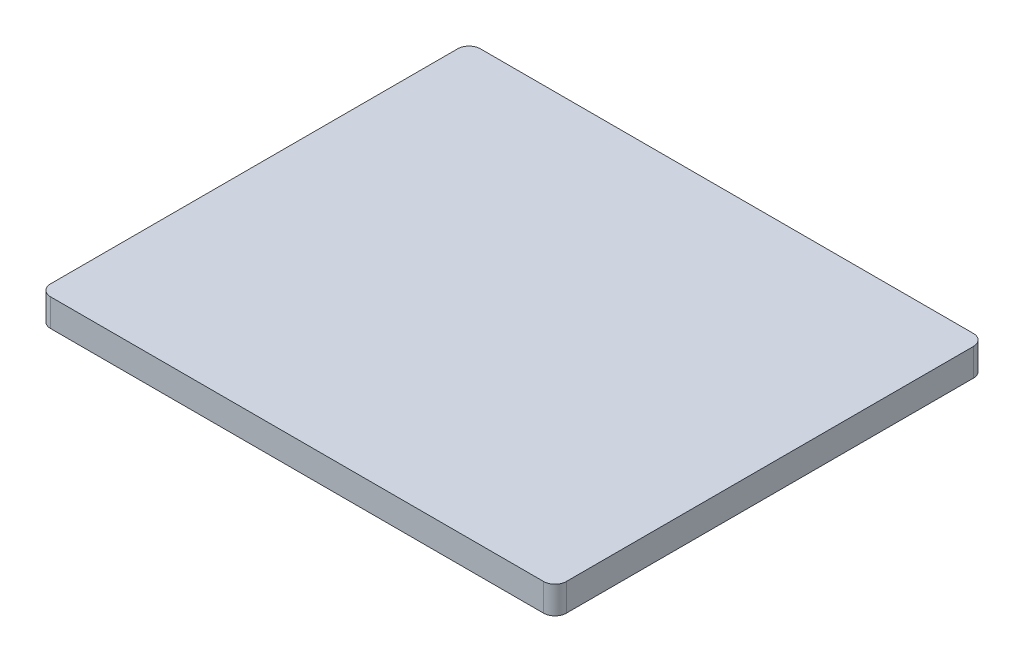
ISO-10303-21;
HEADER;
FILE_DESCRIPTION(('STEP AP214'),'2;1');
FILE_NAME('part.step','',(''),(''),'','','');
FILE_SCHEMA(('AUTOMOTIVE_DESIGN { 1 0 10303 214 1 1 1 1 }'));
ENDSEC;
DATA;
#1=APPLICATION_CONTEXT('core data for automotive mechanical design processes');
#2=APPLICATION_PROTOCOL_DEFINITION('international standard','automotive_design',2000,#1);
#3=PRODUCT_CONTEXT('',#1,'mechanical');
#4=PRODUCT('Part','Part','',(#3));
#5=PRODUCT_RELATED_PRODUCT_CATEGORY('part','',(#4));
#6=PRODUCT_DEFINITION_FORMATION('','',#4);
#7=PRODUCT_DEFINITION_CONTEXT('part definition',#1,'design');
#8=PRODUCT_DEFINITION('design','',#6,#7);
#9=PRODUCT_DEFINITION_SHAPE('','',#8);
#10=(LENGTH_UNIT() NAMED_UNIT(*) SI_UNIT(.MILLI.,.METRE.));
#11=(NAMED_UNIT(*) PLANE_ANGLE_UNIT() SI_UNIT($,.RADIAN.));
#12=(NAMED_UNIT(*) SI_UNIT($,.STERADIAN.) SOLID_ANGLE_UNIT());
#13=UNCERTAINTY_MEASURE_WITH_UNIT(LENGTH_MEASURE(1.E-05),#10,'distance_accuracy_value','');
#14=(GEOMETRIC_REPRESENTATION_CONTEXT(3) GLOBAL_UNCERTAINTY_ASSIGNED_CONTEXT((#13)) GLOBAL_UNIT_ASSIGNED_CONTEXT((#10,
#11,#12)) REPRESENTATION_CONTEXT('',''));
#15=CARTESIAN_POINT('',(0.,0.,0.));
#16=DIRECTION('',(0.,0.,1.));
#17=DIRECTION('',(1.,0.,0.));
#18=AXIS2_PLACEMENT_3D('',#15,#16,#17);
#19=CARTESIAN_POINT('',(143.396,16.,-118.396));
#20=DIRECTION('',(0.,-1.,0.));
#21=DIRECTION('',(0.,0.,-1.));
#22=AXIS2_PLACEMENT_3D('',#19,#20,#21);
#23=CYLINDRICAL_SURFACE('',#22,6.604);
#24=CARTESIAN_POINT('',(143.396,0.,-118.396));
#25=DIRECTION('',(0.,1.,0.));
#26=DIRECTION('',(0.,0.,-1.));
#27=AXIS2_PLACEMENT_3D('',#24,#25,#26);
#28=CIRCLE('',#27,6.604);
#29=CARTESIAN_POINT('',(150.,0.,-118.396));
#30=VERTEX_POINT('',#29);
#31=CARTESIAN_POINT('',(143.396,0.,-125.));
#32=VERTEX_POINT('',#31);
#33=EDGE_CURVE('E130',#30,#32,#28,.T.);
#34=ORIENTED_EDGE('',*,*,#33,.T.);
#35=DIRECTION('',(0.,-1.,0.));
#36=VECTOR('',#35,1.);
#37=CARTESIAN_POINT('',(143.396,16.,-125.));
#38=LINE('',#37,#36);
#39=CARTESIAN_POINT('',(143.396,16.,-125.));
#40=VERTEX_POINT('',#39);
#41=EDGE_CURVE('E11',#40,#32,#38,.T.);
#42=ORIENTED_EDGE('',*,*,#41,.F.);
#43=CARTESIAN_POINT('',(143.396,16.,-118.396));
#44=DIRECTION('',(0.,1.,0.));
#45=DIRECTION('',(0.,0.,-1.));
#46=AXIS2_PLACEMENT_3D('',#43,#44,#45);
#47=CIRCLE('',#46,6.604);
#48=CARTESIAN_POINT('',(150.,16.,-118.396));
#49=VERTEX_POINT('',#48);
#50=EDGE_CURVE('E144',#49,#40,#47,.T.);
#51=ORIENTED_EDGE('',*,*,#50,.F.);
#52=DIRECTION('',(0.,-1.,0.));
#53=VECTOR('',#52,1.);
#54=CARTESIAN_POINT('',(150.,16.,-118.396));
#55=LINE('',#54,#53);
#56=EDGE_CURVE('E126',#49,#30,#55,.T.);
#57=ORIENTED_EDGE('',*,*,#56,.T.);
#58=EDGE_LOOP('',(#34,#42,#51,#57));
#59=FACE_BOUND('',#58,.T.);
#60=ADVANCED_FACE('F34',(#59),#23,.T.);
#61=CARTESIAN_POINT('',(-143.396,16.,-125.));
#62=DIRECTION('',(0.,0.,1.));
#63=DIRECTION('',(1.,0.,0.));
#64=AXIS2_PLACEMENT_3D('',#61,#62,#63);
#65=PLANE('',#64);
#66=DIRECTION('',(-1.,0.,0.));
#67=VECTOR('',#66,1.);
#68=CARTESIAN_POINT('',(-143.396,0.,-125.));
#69=LINE('',#68,#67);
#70=CARTESIAN_POINT('',(-143.396,0.,-125.));
#71=VERTEX_POINT('',#70);
#72=EDGE_CURVE('E133',#32,#71,#69,.T.);
#73=ORIENTED_EDGE('',*,*,#72,.T.);
#74=DIRECTION('',(0.,-1.,0.));
#75=VECTOR('',#74,1.);
#76=CARTESIAN_POINT('',(-143.396,16.,-125.));
#77=LINE('',#76,#75);
#78=CARTESIAN_POINT('',(-143.396,16.,-125.));
#79=VERTEX_POINT('',#78);
#80=EDGE_CURVE('E42',#79,#71,#77,.T.);
#81=ORIENTED_EDGE('',*,*,#80,.F.);
#82=DIRECTION('',(-1.,0.,0.));
#83=VECTOR('',#82,1.);
#84=CARTESIAN_POINT('',(-143.396,16.,-125.));
#85=LINE('',#84,#83);
#86=EDGE_CURVE('E93',#40,#79,#85,.T.);
#87=ORIENTED_EDGE('',*,*,#86,.F.);
#88=ORIENTED_EDGE('',*,*,#41,.T.);
#89=EDGE_LOOP('',(#73,#81,#87,#88));
#90=FACE_BOUND('',#89,.T.);
#91=ADVANCED_FACE('F179',(#90),#65,.F.);
#92=CARTESIAN_POINT('',(-143.396,16.,-118.396));
#93=DIRECTION('',(0.,-1.,0.));
#94=DIRECTION('',(0.,0.,-1.));
#95=AXIS2_PLACEMENT_3D('',#92,#93,#94);
#96=CYLINDRICAL_SURFACE('',#95,6.604);
#97=CARTESIAN_POINT('',(-143.396,0.,-118.396));
#98=DIRECTION('',(0.,1.,0.));
#99=DIRECTION('',(0.,0.,1.));
#100=AXIS2_PLACEMENT_3D('',#97,#98,#99);
#101=CIRCLE('',#100,6.604);
#102=CARTESIAN_POINT('',(-150.,0.,-118.396));
#103=VERTEX_POINT('',#102);
#104=EDGE_CURVE('E135',#71,#103,#101,.T.);
#105=ORIENTED_EDGE('',*,*,#104,.T.);
#106=DIRECTION('',(0.,-1.,0.));
#107=VECTOR('',#106,1.);
#108=CARTESIAN_POINT('',(-150.,16.,-118.396));
#109=LINE('',#108,#107);
#110=CARTESIAN_POINT('',(-150.,16.,-118.396));
#111=VERTEX_POINT('',#110);
#112=EDGE_CURVE('E151',#111,#103,#109,.T.);
#113=ORIENTED_EDGE('',*,*,#112,.F.);
#114=CARTESIAN_POINT('',(-143.396,16.,-118.396));
#115=DIRECTION('',(0.,1.,0.));
#116=DIRECTION('',(0.,0.,1.));
#117=AXIS2_PLACEMENT_3D('',#114,#115,#116);
#118=CIRCLE('',#117,6.604);
#119=EDGE_CURVE('E159',#79,#111,#118,.T.);
#120=ORIENTED_EDGE('',*,*,#119,.F.);
#121=ORIENTED_EDGE('',*,*,#80,.T.);
#122=EDGE_LOOP('',(#105,#113,#120,#121));
#123=FACE_BOUND('',#122,.T.);
#124=ADVANCED_FACE('F157',(#123),#96,.T.);
#125=CARTESIAN_POINT('',(-150.,16.,-118.396));
#126=DIRECTION('',(1.,0.,0.));
#127=DIRECTION('',(0.,0.,-1.));
#128=AXIS2_PLACEMENT_3D('',#125,#126,#127);
#129=PLANE('',#128);
#130=DIRECTION('',(0.,0.,1.));
#131=VECTOR('',#130,1.);
#132=CARTESIAN_POINT('',(-150.,0.,-118.396));
#133=LINE('',#132,#131);
#134=CARTESIAN_POINT('',(-150.,0.,118.396));
#135=VERTEX_POINT('',#134);
#136=EDGE_CURVE('E137',#103,#135,#133,.T.);
#137=ORIENTED_EDGE('',*,*,#136,.T.);
#138=DIRECTION('',(0.,-1.,0.));
#139=VECTOR('',#138,1.);
#140=CARTESIAN_POINT('',(-150.,16.,118.396));
#141=LINE('',#140,#139);
#142=CARTESIAN_POINT('',(-150.,16.,118.396));
#143=VERTEX_POINT('',#142);
#144=EDGE_CURVE('E148',#143,#135,#141,.T.);
#145=ORIENTED_EDGE('',*,*,#144,.F.);
#146=DIRECTION('',(0.,0.,1.));
#147=VECTOR('',#146,1.);
#148=CARTESIAN_POINT('',(-150.,16.,-118.396));
#149=LINE('',#148,#147);
#150=EDGE_CURVE('E171',#111,#143,#149,.T.);
#151=ORIENTED_EDGE('',*,*,#150,.F.);
#152=ORIENTED_EDGE('',*,*,#112,.T.);
#153=EDGE_LOOP('',(#137,#145,#151,#152));
#154=FACE_BOUND('',#153,.T.);
#155=ADVANCED_FACE('F167',(#154),#129,.F.);
#156=CARTESIAN_POINT('',(-143.396,16.,118.396));
#157=DIRECTION('',(0.,-1.,0.));
#158=DIRECTION('',(0.,0.,-1.));
#159=AXIS2_PLACEMENT_3D('',#156,#157,#158);
#160=CYLINDRICAL_SURFACE('',#159,6.60400000000001);
#161=CARTESIAN_POINT('',(-143.396,0.,118.396));
#162=DIRECTION('',(0.,1.,0.));
#163=DIRECTION('',(0.,0.,1.));
#164=AXIS2_PLACEMENT_3D('',#161,#162,#163);
#165=CIRCLE('',#164,6.60400000000001);
#166=CARTESIAN_POINT('',(-143.396,0.,125.));
#167=VERTEX_POINT('',#166);
#168=EDGE_CURVE('E139',#135,#167,#165,.T.);
#169=ORIENTED_EDGE('',*,*,#168,.T.);
#170=DIRECTION('',(0.,-1.,0.));
#171=VECTOR('',#170,1.);
#172=CARTESIAN_POINT('',(-143.396,16.,125.));
#173=LINE('',#172,#171);
#174=CARTESIAN_POINT('',(-143.396,16.,125.));
#175=VERTEX_POINT('',#174);
#176=EDGE_CURVE('E121',#175,#167,#173,.T.);
#177=ORIENTED_EDGE('',*,*,#176,.F.);
#178=CARTESIAN_POINT('',(-143.396,16.,118.396));
#179=DIRECTION('',(0.,1.,0.));
#180=DIRECTION('',(0.,0.,1.));
#181=AXIS2_PLACEMENT_3D('',#178,#179,#180);
#182=CIRCLE('',#181,6.60400000000001);
#183=EDGE_CURVE('E112',#143,#175,#182,.T.);
#184=ORIENTED_EDGE('',*,*,#183,.F.);
#185=ORIENTED_EDGE('',*,*,#144,.T.);
#186=EDGE_LOOP('',(#169,#177,#184,#185));
#187=FACE_BOUND('',#186,.T.);
#188=ADVANCED_FACE('F170',(#187),#160,.T.);
#189=CARTESIAN_POINT('',(-143.396,16.,125.));
#190=DIRECTION('',(0.,0.,-1.));
#191=DIRECTION('',(-1.,0.,0.));
#192=AXIS2_PLACEMENT_3D('',#189,#190,#191);
#193=PLANE('',#192);
#194=DIRECTION('',(1.,0.,0.));
#195=VECTOR('',#194,1.);
#196=CARTESIAN_POINT('',(-143.396,0.,125.));
#197=LINE('',#196,#195);
#198=CARTESIAN_POINT('',(143.396,0.,125.));
#199=VERTEX_POINT('',#198);
#200=EDGE_CURVE('E120',#167,#199,#197,.T.);
#201=ORIENTED_EDGE('',*,*,#200,.T.);
#202=DIRECTION('',(0.,-1.,0.));
#203=VECTOR('',#202,1.);
#204=CARTESIAN_POINT('',(143.396,16.,125.));
#205=LINE('',#204,#203);
#206=CARTESIAN_POINT('',(143.396,16.,125.));
#207=VERTEX_POINT('',#206);
#208=EDGE_CURVE('E117',#207,#199,#205,.T.);
#209=ORIENTED_EDGE('',*,*,#208,.F.);
#210=DIRECTION('',(1.,0.,0.));
#211=VECTOR('',#210,1.);
#212=CARTESIAN_POINT('',(-143.396,16.,125.));
#213=LINE('',#212,#211);
#214=EDGE_CURVE('E106',#175,#207,#213,.T.);
#215=ORIENTED_EDGE('',*,*,#214,.F.);
#216=ORIENTED_EDGE('',*,*,#176,.T.);
#217=EDGE_LOOP('',(#201,#209,#215,#216));
#218=FACE_BOUND('',#217,.T.);
#219=ADVANCED_FACE('F118',(#218),#193,.F.);
#220=CARTESIAN_POINT('',(143.396,16.,118.396));
#221=DIRECTION('',(0.,-1.,0.));
#222=DIRECTION('',(0.,0.,-1.));
#223=AXIS2_PLACEMENT_3D('',#220,#221,#222);
#224=CYLINDRICAL_SURFACE('',#223,6.60399999999997);
#225=CARTESIAN_POINT('',(143.396,0.,118.396));
#226=DIRECTION('',(0.,1.,0.));
#227=DIRECTION('',(0.,0.,1.));
#228=AXIS2_PLACEMENT_3D('',#225,#226,#227);
#229=CIRCLE('',#228,6.60399999999997);
#230=CARTESIAN_POINT('',(150.,0.,118.396));
#231=VERTEX_POINT('',#230);
#232=EDGE_CURVE('E79',#199,#231,#229,.T.);
#233=ORIENTED_EDGE('',*,*,#232,.T.);
#234=DIRECTION('',(0.,-1.,0.));
#235=VECTOR('',#234,1.);
#236=CARTESIAN_POINT('',(150.,16.,118.396));
#237=LINE('',#236,#235);
#238=CARTESIAN_POINT('',(150.,16.,118.396));
#239=VERTEX_POINT('',#238);
#240=EDGE_CURVE('E122',#239,#231,#237,.T.);
#241=ORIENTED_EDGE('',*,*,#240,.F.);
#242=CARTESIAN_POINT('',(143.396,16.,118.396));
#243=DIRECTION('',(0.,1.,0.));
#244=DIRECTION('',(0.,0.,1.));
#245=AXIS2_PLACEMENT_3D('',#242,#243,#244);
#246=CIRCLE('',#245,6.60399999999997);
#247=EDGE_CURVE('E110',#207,#239,#246,.T.);
#248=ORIENTED_EDGE('',*,*,#247,.F.);
#249=ORIENTED_EDGE('',*,*,#208,.T.);
#250=EDGE_LOOP('',(#233,#241,#248,#249));
#251=FACE_BOUND('',#250,.T.);
#252=ADVANCED_FACE('F124',(#251),#224,.T.);
#253=CARTESIAN_POINT('',(150.,16.,-118.396));
#254=DIRECTION('',(-1.,0.,0.));
#255=DIRECTION('',(0.,0.,1.));
#256=AXIS2_PLACEMENT_3D('',#253,#254,#255);
#257=PLANE('',#256);
#258=DIRECTION('',(0.,0.,-1.));
#259=VECTOR('',#258,1.);
#260=CARTESIAN_POINT('',(150.,0.,-118.396));
#261=LINE('',#260,#259);
#262=EDGE_CURVE('E85',#231,#30,#261,.T.);
#263=ORIENTED_EDGE('',*,*,#262,.T.);
#264=ORIENTED_EDGE('',*,*,#56,.F.);
#265=DIRECTION('',(0.,0.,-1.));
#266=VECTOR('',#265,1.);
#267=CARTESIAN_POINT('',(150.,16.,-118.396));
#268=LINE('',#267,#266);
#269=EDGE_CURVE('E50',#239,#49,#268,.T.);
#270=ORIENTED_EDGE('',*,*,#269,.F.);
#271=ORIENTED_EDGE('',*,*,#240,.T.);
#272=EDGE_LOOP('',(#263,#264,#270,#271));
#273=FACE_BOUND('',#272,.T.);
#274=ADVANCED_FACE('F195',(#273),#257,.F.);
#275=CARTESIAN_POINT('',(143.396,16.,-118.396));
#276=DIRECTION('',(0.,-1.,0.));
#277=DIRECTION('',(0.,0.,-1.));
#278=AXIS2_PLACEMENT_3D('',#275,#276,#277);
#279=PLANE('',#278);
#280=ORIENTED_EDGE('',*,*,#50,.T.);
#281=ORIENTED_EDGE('',*,*,#86,.T.);
#282=ORIENTED_EDGE('',*,*,#119,.T.);
#283=ORIENTED_EDGE('',*,*,#150,.T.);
#284=ORIENTED_EDGE('',*,*,#183,.T.);
#285=ORIENTED_EDGE('',*,*,#214,.T.);
#286=ORIENTED_EDGE('',*,*,#247,.T.);
#287=ORIENTED_EDGE('',*,*,#269,.T.);
#288=EDGE_LOOP('',(#280,#281,#282,#283,#284,#285,#286,#287));
#289=FACE_BOUND('',#288,.T.);
#290=ADVANCED_FACE('F108',(#289),#279,.F.);
#291=CARTESIAN_POINT('',(143.396,0.,-118.396));
#292=DIRECTION('',(0.,-1.,0.));
#293=DIRECTION('',(0.,0.,-1.));
#294=AXIS2_PLACEMENT_3D('',#291,#292,#293);
#295=PLANE('',#294);
#296=ORIENTED_EDGE('',*,*,#33,.F.);
#297=ORIENTED_EDGE('',*,*,#262,.F.);
#298=ORIENTED_EDGE('',*,*,#232,.F.);
#299=ORIENTED_EDGE('',*,*,#200,.F.);
#300=ORIENTED_EDGE('',*,*,#168,.F.);
#301=ORIENTED_EDGE('',*,*,#136,.F.);
#302=ORIENTED_EDGE('',*,*,#104,.F.);
#303=ORIENTED_EDGE('',*,*,#72,.F.);
#304=EDGE_LOOP('',(#296,#297,#298,#299,#300,#301,#302,#303));
#305=FACE_BOUND('',#304,.T.);
#306=ADVANCED_FACE('F163',(#305),#295,.T.);
#307=CLOSED_SHELL('',(#60,#91,#124,#155,#188,#219,#252,#274,#290,#306));
#308=MANIFOLD_SOLID_BREP('B2',#307);
#309=ADVANCED_BREP_SHAPE_REPRESENTATION('',(#18,#308),#14);
#310=SHAPE_DEFINITION_REPRESENTATION(#9,#309);
ENDSEC;
END-ISO-10303-21;
